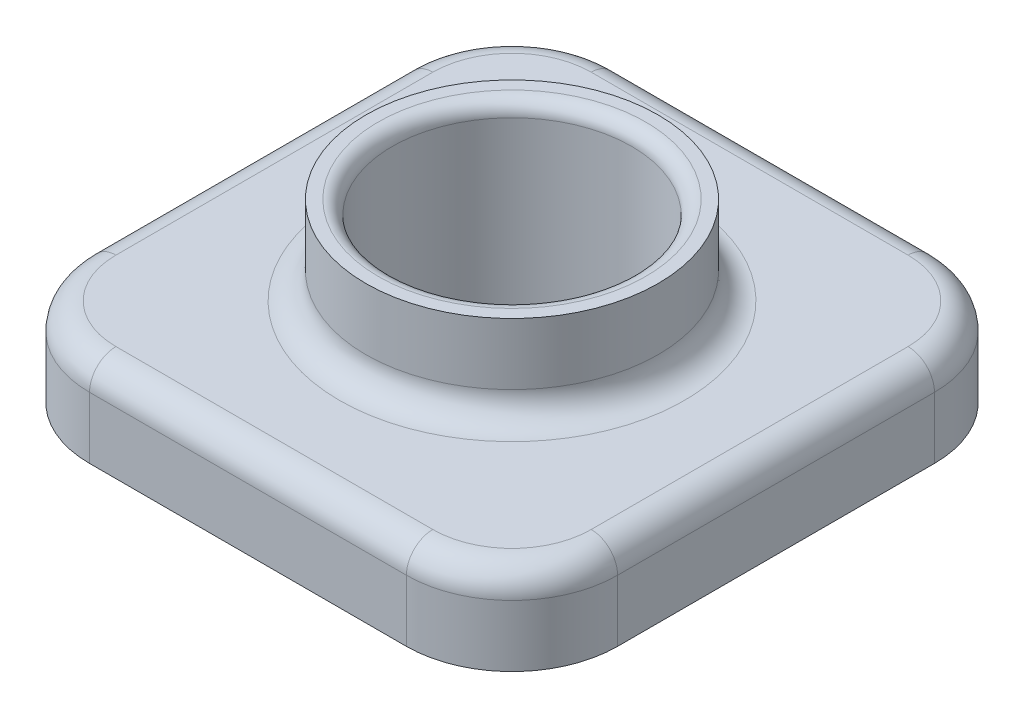
ISO-10303-21;
HEADER;
FILE_DESCRIPTION(('STEP AP214'),'2;1');
FILE_NAME('part.step','',(''),(''),'','','');
FILE_SCHEMA(('AUTOMOTIVE_DESIGN { 1 0 10303 214 1 1 1 1 }'));
ENDSEC;
DATA;
#1=APPLICATION_CONTEXT('core data for automotive mechanical design processes');
#2=APPLICATION_PROTOCOL_DEFINITION('international standard','automotive_design',2000,#1);
#3=PRODUCT_CONTEXT('',#1,'mechanical');
#4=PRODUCT('Part','Part','',(#3));
#5=PRODUCT_RELATED_PRODUCT_CATEGORY('part','',(#4));
#6=PRODUCT_DEFINITION_FORMATION('','',#4);
#7=PRODUCT_DEFINITION_CONTEXT('part definition',#1,'design');
#8=PRODUCT_DEFINITION('design','',#6,#7);
#9=PRODUCT_DEFINITION_SHAPE('','',#8);
#10=(LENGTH_UNIT() NAMED_UNIT(*) SI_UNIT(.MILLI.,.METRE.));
#11=(NAMED_UNIT(*) PLANE_ANGLE_UNIT() SI_UNIT($,.RADIAN.));
#12=(NAMED_UNIT(*) SI_UNIT($,.STERADIAN.) SOLID_ANGLE_UNIT());
#13=UNCERTAINTY_MEASURE_WITH_UNIT(LENGTH_MEASURE(1.E-05),#10,'distance_accuracy_value','');
#14=(GEOMETRIC_REPRESENTATION_CONTEXT(3) GLOBAL_UNCERTAINTY_ASSIGNED_CONTEXT((#13)) GLOBAL_UNIT_ASSIGNED_CONTEXT((#10,
#11,#12)) REPRESENTATION_CONTEXT('',''));
#15=CARTESIAN_POINT('',(0.,0.,0.));
#16=DIRECTION('',(0.,0.,1.));
#17=DIRECTION('',(1.,0.,0.));
#18=AXIS2_PLACEMENT_3D('',#15,#16,#17);
#19=CARTESIAN_POINT('',(0.,5.,0.));
#20=DIRECTION('',(0.,1.,0.));
#21=DIRECTION('',(0.,0.,1.));
#22=AXIS2_PLACEMENT_3D('',#19,#20,#21);
#23=PLANE('',#22);
#24=CARTESIAN_POINT('',(0.,5.,0.));
#25=DIRECTION('',(0.,1.,0.));
#26=DIRECTION('',(0.,0.,1.));
#27=AXIS2_PLACEMENT_3D('',#24,#25,#26);
#28=CIRCLE('',#27,7.6);
#29=CARTESIAN_POINT('',(0.,5.,7.6));
#30=VERTEX_POINT('',#29);
#31=EDGE_CURVE('E181',#30,#30,#28,.F.);
#32=ORIENTED_EDGE('',*,*,#31,.T.);
#33=EDGE_LOOP('',(#32));
#34=FACE_BOUND('',#33,.T.);
#35=CARTESIAN_POINT('',(0.,5.,0.));
#36=DIRECTION('',(0.,1.,0.));
#37=DIRECTION('',(0.,0.,1.));
#38=AXIS2_PLACEMENT_3D('',#35,#36,#37);
#39=CIRCLE('',#38,8.3);
#40=CARTESIAN_POINT('',(0.,5.,8.3));
#41=VERTEX_POINT('',#40);
#42=EDGE_CURVE('E167',#41,#41,#39,.T.);
#43=ORIENTED_EDGE('',*,*,#42,.T.);
#44=EDGE_LOOP('',(#43));
#45=FACE_BOUND('',#44,.T.);
#46=ADVANCED_FACE('F45',(#34,#45),#23,.T.);
#47=CARTESIAN_POINT('',(0.,5.,0.));
#48=DIRECTION('',(0.,-1.,0.));
#49=DIRECTION('',(0.,0.,-1.));
#50=AXIS2_PLACEMENT_3D('',#47,#48,#49);
#51=CYLINDRICAL_SURFACE('',#50,8.3);
#52=CARTESIAN_POINT('',(0.,1.5,0.));
#53=DIRECTION('',(0.,1.,0.));
#54=DIRECTION('',(0.,0.,1.));
#55=AXIS2_PLACEMENT_3D('',#52,#53,#54);
#56=CIRCLE('',#55,8.3);
#57=CARTESIAN_POINT('',(0.,1.5,8.3));
#58=VERTEX_POINT('',#57);
#59=EDGE_CURVE('E11',#58,#58,#56,.T.);
#60=ORIENTED_EDGE('',*,*,#59,.T.);
#61=EDGE_LOOP('',(#60));
#62=FACE_BOUND('',#61,.T.);
#63=ORIENTED_EDGE('',*,*,#42,.F.);
#64=EDGE_LOOP('',(#63));
#65=FACE_BOUND('',#64,.T.);
#66=ADVANCED_FACE('F365',(#62,#65),#51,.T.);
#67=CARTESIAN_POINT('',(0.,5.,0.));
#68=DIRECTION('',(0.,-1.,0.));
#69=DIRECTION('',(0.,0.,-1.));
#70=AXIS2_PLACEMENT_3D('',#67,#68,#69);
#71=CYLINDRICAL_SURFACE('',#70,6.8);
#72=CARTESIAN_POINT('',(0.,4.2,0.));
#73=DIRECTION('',(0.,1.,0.));
#74=DIRECTION('',(0.,0.,1.));
#75=AXIS2_PLACEMENT_3D('',#72,#73,#74);
#76=CIRCLE('',#75,6.8);
#77=CARTESIAN_POINT('',(0.,4.2,6.8));
#78=VERTEX_POINT('',#77);
#79=EDGE_CURVE('E172',#78,#78,#76,.T.);
#80=ORIENTED_EDGE('',*,*,#79,.T.);
#81=EDGE_LOOP('',(#80));
#82=FACE_BOUND('',#81,.T.);
#83=CARTESIAN_POINT('',(0.,-5.,0.));
#84=DIRECTION('',(0.,-1.,0.));
#85=DIRECTION('',(0.,0.,-1.));
#86=AXIS2_PLACEMENT_3D('',#83,#84,#85);
#87=CIRCLE('',#86,6.8);
#88=CARTESIAN_POINT('',(0.,-5.,-6.8));
#89=VERTEX_POINT('',#88);
#90=EDGE_CURVE('E162',#89,#89,#87,.T.);
#91=ORIENTED_EDGE('',*,*,#90,.T.);
#92=EDGE_LOOP('',(#91));
#93=FACE_BOUND('',#92,.T.);
#94=ADVANCED_FACE('F373',(#82,#93),#71,.F.);
#95=CARTESIAN_POINT('',(-9.,-5.,-9.));
#96=DIRECTION('',(0.,1.,0.));
#97=DIRECTION('',(0.,0.,1.));
#98=AXIS2_PLACEMENT_3D('',#95,#96,#97);
#99=PLANE('',#98);
#100=CARTESIAN_POINT('',(-9.,-5.,-9.));
#101=DIRECTION('',(0.,-1.,0.));
#102=DIRECTION('',(0.,0.,1.));
#103=AXIS2_PLACEMENT_3D('',#100,#101,#102);
#104=CIRCLE('',#103,6.);
#105=CARTESIAN_POINT('',(-15.,-5.,-8.99999999999996));
#106=VERTEX_POINT('',#105);
#107=CARTESIAN_POINT('',(-8.99999999999995,-5.,-15.));
#108=VERTEX_POINT('',#107);
#109=EDGE_CURVE('E153',#106,#108,#104,.T.);
#110=ORIENTED_EDGE('',*,*,#109,.T.);
#111=DIRECTION('',(1.,0.,0.));
#112=VECTOR('',#111,1.);
#113=CARTESIAN_POINT('',(-8.99999999999995,-5.,-15.));
#114=LINE('',#113,#112);
#115=CARTESIAN_POINT('',(8.99999999999996,-5.,-15.));
#116=VERTEX_POINT('',#115);
#117=EDGE_CURVE('E140',#108,#116,#114,.T.);
#118=ORIENTED_EDGE('',*,*,#117,.T.);
#119=CARTESIAN_POINT('',(9.00000000000001,-5.,-9.));
#120=DIRECTION('',(0.,-1.,0.));
#121=DIRECTION('',(0.,0.,-1.));
#122=AXIS2_PLACEMENT_3D('',#119,#120,#121);
#123=CIRCLE('',#122,6.);
#124=CARTESIAN_POINT('',(15.,-5.,-8.99999999999996));
#125=VERTEX_POINT('',#124);
#126=EDGE_CURVE('E152',#116,#125,#123,.T.);
#127=ORIENTED_EDGE('',*,*,#126,.T.);
#128=DIRECTION('',(0.,0.,1.));
#129=VECTOR('',#128,1.);
#130=CARTESIAN_POINT('',(15.,-5.,-8.99999999999996));
#131=LINE('',#130,#129);
#132=CARTESIAN_POINT('',(15.,-5.,8.99999999999996));
#133=VERTEX_POINT('',#132);
#134=EDGE_CURVE('E276',#125,#133,#131,.T.);
#135=ORIENTED_EDGE('',*,*,#134,.T.);
#136=CARTESIAN_POINT('',(9.,-5.,9.));
#137=DIRECTION('',(0.,-1.,0.));
#138=DIRECTION('',(0.,0.,1.));
#139=AXIS2_PLACEMENT_3D('',#136,#137,#138);
#140=CIRCLE('',#139,6.);
#141=CARTESIAN_POINT('',(8.99999999999996,-5.,15.));
#142=VERTEX_POINT('',#141);
#143=EDGE_CURVE('E279',#133,#142,#140,.T.);
#144=ORIENTED_EDGE('',*,*,#143,.T.);
#145=DIRECTION('',(-1.,0.,0.));
#146=VECTOR('',#145,1.);
#147=CARTESIAN_POINT('',(-8.99999999999995,-5.,15.));
#148=LINE('',#147,#146);
#149=CARTESIAN_POINT('',(-8.99999999999995,-5.,15.));
#150=VERTEX_POINT('',#149);
#151=EDGE_CURVE('E282',#142,#150,#148,.T.);
#152=ORIENTED_EDGE('',*,*,#151,.T.);
#153=CARTESIAN_POINT('',(-9.,-5.,9.));
#154=DIRECTION('',(0.,-1.,0.));
#155=DIRECTION('',(0.,0.,1.));
#156=AXIS2_PLACEMENT_3D('',#153,#154,#155);
#157=CIRCLE('',#156,6.);
#158=CARTESIAN_POINT('',(-15.,-5.,8.99999999999995));
#159=VERTEX_POINT('',#158);
#160=EDGE_CURVE('E285',#150,#159,#157,.T.);
#161=ORIENTED_EDGE('',*,*,#160,.T.);
#162=DIRECTION('',(0.,0.,-1.));
#163=VECTOR('',#162,1.);
#164=CARTESIAN_POINT('',(-15.,-5.,-8.99999999999996));
#165=LINE('',#164,#163);
#166=EDGE_CURVE('E159',#159,#106,#165,.T.);
#167=ORIENTED_EDGE('',*,*,#166,.T.);
#168=EDGE_LOOP('',(#110,#118,#127,#135,#144,#152,#161,#167));
#169=FACE_BOUND('',#168,.T.);
#170=ORIENTED_EDGE('',*,*,#90,.F.);
#171=EDGE_LOOP('',(#170));
#172=FACE_BOUND('',#171,.T.);
#173=ADVANCED_FACE('F156',(#169,#172),#99,.F.);
#174=CARTESIAN_POINT('',(-9.,0.,-9.));
#175=DIRECTION('',(0.,1.,0.));
#176=DIRECTION('',(0.,0.,1.));
#177=AXIS2_PLACEMENT_3D('',#174,#175,#176);
#178=PLANE('',#177);
#179=CARTESIAN_POINT('',(9.00000000000001,0.,-9.));
#180=DIRECTION('',(0.,1.,0.));
#181=DIRECTION('',(0.,0.,1.));
#182=AXIS2_PLACEMENT_3D('',#179,#180,#181);
#183=CIRCLE('',#182,4.5);
#184=CARTESIAN_POINT('',(13.5,0.,-8.99999999999997));
#185=VERTEX_POINT('',#184);
#186=CARTESIAN_POINT('',(8.99999999999996,0.,-13.5));
#187=VERTEX_POINT('',#186);
#188=EDGE_CURVE('E210',#185,#187,#183,.T.);
#189=ORIENTED_EDGE('',*,*,#188,.T.);
#190=DIRECTION('',(1.,0.,0.));
#191=VECTOR('',#190,1.);
#192=CARTESIAN_POINT('',(-8.99999999999995,0.,-13.5));
#193=LINE('',#192,#191);
#194=CARTESIAN_POINT('',(-8.99999999999995,0.,-13.5));
#195=VERTEX_POINT('',#194);
#196=EDGE_CURVE('E213',#187,#195,#193,.F.);
#197=ORIENTED_EDGE('',*,*,#196,.T.);
#198=CARTESIAN_POINT('',(-9.,0.,-9.));
#199=DIRECTION('',(0.,1.,0.));
#200=DIRECTION('',(0.,0.,1.));
#201=AXIS2_PLACEMENT_3D('',#198,#199,#200);
#202=CIRCLE('',#201,4.5);
#203=CARTESIAN_POINT('',(-13.5,0.,-8.99999999999996));
#204=VERTEX_POINT('',#203);
#205=EDGE_CURVE('E192',#195,#204,#202,.T.);
#206=ORIENTED_EDGE('',*,*,#205,.T.);
#207=DIRECTION('',(0.,0.,-1.));
#208=VECTOR('',#207,1.);
#209=CARTESIAN_POINT('',(-13.5,0.,8.99999999999995));
#210=LINE('',#209,#208);
#211=CARTESIAN_POINT('',(-13.5,0.,8.99999999999996));
#212=VERTEX_POINT('',#211);
#213=EDGE_CURVE('E195',#204,#212,#210,.F.);
#214=ORIENTED_EDGE('',*,*,#213,.T.);
#215=CARTESIAN_POINT('',(-9.,0.,9.));
#216=DIRECTION('',(0.,1.,0.));
#217=DIRECTION('',(0.,0.,1.));
#218=AXIS2_PLACEMENT_3D('',#215,#216,#217);
#219=CIRCLE('',#218,4.5);
#220=CARTESIAN_POINT('',(-8.99999999999995,0.,13.5));
#221=VERTEX_POINT('',#220);
#222=EDGE_CURVE('E198',#212,#221,#219,.T.);
#223=ORIENTED_EDGE('',*,*,#222,.T.);
#224=DIRECTION('',(-1.,0.,0.));
#225=VECTOR('',#224,1.);
#226=CARTESIAN_POINT('',(8.99999999999996,0.,13.5));
#227=LINE('',#226,#225);
#228=CARTESIAN_POINT('',(8.99999999999997,0.,13.5));
#229=VERTEX_POINT('',#228);
#230=EDGE_CURVE('E201',#221,#229,#227,.F.);
#231=ORIENTED_EDGE('',*,*,#230,.T.);
#232=CARTESIAN_POINT('',(9.,0.,9.));
#233=DIRECTION('',(0.,1.,0.));
#234=DIRECTION('',(0.,0.,1.));
#235=AXIS2_PLACEMENT_3D('',#232,#233,#234);
#236=CIRCLE('',#235,4.5);
#237=CARTESIAN_POINT('',(13.5,0.,8.99999999999996));
#238=VERTEX_POINT('',#237);
#239=EDGE_CURVE('E204',#229,#238,#236,.T.);
#240=ORIENTED_EDGE('',*,*,#239,.T.);
#241=DIRECTION('',(0.,0.,1.));
#242=VECTOR('',#241,1.);
#243=CARTESIAN_POINT('',(13.5,0.,-8.99999999999996));
#244=LINE('',#243,#242);
#245=EDGE_CURVE('E207',#238,#185,#244,.F.);
#246=ORIENTED_EDGE('',*,*,#245,.T.);
#247=EDGE_LOOP('',(#189,#197,#206,#214,#223,#231,#240,#246));
#248=FACE_BOUND('',#247,.T.);
#249=CARTESIAN_POINT('',(0.,0.,0.));
#250=DIRECTION('',(0.,1.,0.));
#251=DIRECTION('',(0.,0.,1.));
#252=AXIS2_PLACEMENT_3D('',#249,#250,#251);
#253=CIRCLE('',#252,9.8);
#254=CARTESIAN_POINT('',(0.,0.,9.8));
#255=VERTEX_POINT('',#254);
#256=EDGE_CURVE('E188',#255,#255,#253,.F.);
#257=ORIENTED_EDGE('',*,*,#256,.T.);
#258=EDGE_LOOP('',(#257));
#259=FACE_BOUND('',#258,.T.);
#260=ADVANCED_FACE('F327',(#248,#259),#178,.T.);
#261=CARTESIAN_POINT('',(-9.,-5.,-9.));
#262=DIRECTION('',(0.,1.,0.));
#263=DIRECTION('',(0.,0.,1.));
#264=AXIS2_PLACEMENT_3D('',#261,#262,#263);
#265=CYLINDRICAL_SURFACE('',#264,6.);
#266=DIRECTION('',(0.,1.,0.));
#267=VECTOR('',#266,1.);
#268=CARTESIAN_POINT('',(-15.,-5.,-8.99999999999996));
#269=LINE('',#268,#267);
#270=CARTESIAN_POINT('',(-15.,-1.5,-8.99999999999996));
#271=VERTEX_POINT('',#270);
#272=EDGE_CURVE('E290',#106,#271,#269,.T.);
#273=ORIENTED_EDGE('',*,*,#272,.T.);
#274=CARTESIAN_POINT('',(-9.,-1.5,-9.));
#275=DIRECTION('',(0.,1.,0.));
#276=DIRECTION('',(0.,0.,1.));
#277=AXIS2_PLACEMENT_3D('',#274,#275,#276);
#278=CIRCLE('',#277,6.);
#279=CARTESIAN_POINT('',(-8.99999999999995,-1.5,-15.));
#280=VERTEX_POINT('',#279);
#281=EDGE_CURVE('E55',#271,#280,#278,.F.);
#282=ORIENTED_EDGE('',*,*,#281,.T.);
#283=DIRECTION('',(0.,1.,0.));
#284=VECTOR('',#283,1.);
#285=CARTESIAN_POINT('',(-8.99999999999995,-5.,-15.));
#286=LINE('',#285,#284);
#287=EDGE_CURVE('E145',#108,#280,#286,.T.);
#288=ORIENTED_EDGE('',*,*,#287,.F.);
#289=ORIENTED_EDGE('',*,*,#109,.F.);
#290=EDGE_LOOP('',(#273,#282,#288,#289));
#291=FACE_BOUND('',#290,.T.);
#292=ADVANCED_FACE('F164',(#291),#265,.T.);
#293=CARTESIAN_POINT('',(-8.99999999999995,-5.,-15.));
#294=DIRECTION('',(0.,0.,1.));
#295=DIRECTION('',(1.,0.,0.));
#296=AXIS2_PLACEMENT_3D('',#293,#294,#295);
#297=PLANE('',#296);
#298=ORIENTED_EDGE('',*,*,#287,.T.);
#299=DIRECTION('',(1.,0.,0.));
#300=VECTOR('',#299,1.);
#301=CARTESIAN_POINT('',(8.99999999999996,-1.5,-15.));
#302=LINE('',#301,#300);
#303=CARTESIAN_POINT('',(8.99999999999996,-1.5,-15.));
#304=VERTEX_POINT('',#303);
#305=EDGE_CURVE('E185',#280,#304,#302,.T.);
#306=ORIENTED_EDGE('',*,*,#305,.T.);
#307=DIRECTION('',(0.,1.,0.));
#308=VECTOR('',#307,1.);
#309=CARTESIAN_POINT('',(8.99999999999996,-5.,-15.));
#310=LINE('',#309,#308);
#311=EDGE_CURVE('E148',#116,#304,#310,.T.);
#312=ORIENTED_EDGE('',*,*,#311,.F.);
#313=ORIENTED_EDGE('',*,*,#117,.F.);
#314=EDGE_LOOP('',(#298,#306,#312,#313));
#315=FACE_BOUND('',#314,.T.);
#316=ADVANCED_FACE('F142',(#315),#297,.F.);
#317=CARTESIAN_POINT('',(9.00000000000001,-5.,-9.));
#318=DIRECTION('',(0.,1.,0.));
#319=DIRECTION('',(0.,0.,1.));
#320=AXIS2_PLACEMENT_3D('',#317,#318,#319);
#321=CYLINDRICAL_SURFACE('',#320,6.);
#322=ORIENTED_EDGE('',*,*,#311,.T.);
#323=CARTESIAN_POINT('',(9.00000000000001,-1.5,-9.));
#324=DIRECTION('',(0.,1.,0.));
#325=DIRECTION('',(0.,0.,1.));
#326=AXIS2_PLACEMENT_3D('',#323,#324,#325);
#327=CIRCLE('',#326,6.);
#328=CARTESIAN_POINT('',(15.,-1.5,-8.99999999999996));
#329=VERTEX_POINT('',#328);
#330=EDGE_CURVE('E217',#304,#329,#327,.F.);
#331=ORIENTED_EDGE('',*,*,#330,.T.);
#332=DIRECTION('',(0.,1.,0.));
#333=VECTOR('',#332,1.);
#334=CARTESIAN_POINT('',(15.,-5.,-8.99999999999996));
#335=LINE('',#334,#333);
#336=EDGE_CURVE('E174',#125,#329,#335,.T.);
#337=ORIENTED_EDGE('',*,*,#336,.F.);
#338=ORIENTED_EDGE('',*,*,#126,.F.);
#339=EDGE_LOOP('',(#322,#331,#337,#338));
#340=FACE_BOUND('',#339,.T.);
#341=ADVANCED_FACE('F355',(#340),#321,.T.);
#342=CARTESIAN_POINT('',(15.,-5.,-8.99999999999996));
#343=DIRECTION('',(-1.,0.,0.));
#344=DIRECTION('',(0.,0.,1.));
#345=AXIS2_PLACEMENT_3D('',#342,#343,#344);
#346=PLANE('',#345);
#347=ORIENTED_EDGE('',*,*,#336,.T.);
#348=DIRECTION('',(0.,0.,1.));
#349=VECTOR('',#348,1.);
#350=CARTESIAN_POINT('',(15.,-1.5,8.99999999999996));
#351=LINE('',#350,#349);
#352=CARTESIAN_POINT('',(15.,-1.5,8.99999999999996));
#353=VERTEX_POINT('',#352);
#354=EDGE_CURVE('E220',#329,#353,#351,.T.);
#355=ORIENTED_EDGE('',*,*,#354,.T.);
#356=DIRECTION('',(0.,1.,0.));
#357=VECTOR('',#356,1.);
#358=CARTESIAN_POINT('',(15.,-5.,8.99999999999996));
#359=LINE('',#358,#357);
#360=EDGE_CURVE('E303',#133,#353,#359,.T.);
#361=ORIENTED_EDGE('',*,*,#360,.F.);
#362=ORIENTED_EDGE('',*,*,#134,.F.);
#363=EDGE_LOOP('',(#347,#355,#361,#362));
#364=FACE_BOUND('',#363,.T.);
#365=ADVANCED_FACE('F312',(#364),#346,.F.);
#366=CARTESIAN_POINT('',(9.,-5.,9.));
#367=DIRECTION('',(0.,1.,0.));
#368=DIRECTION('',(0.,0.,1.));
#369=AXIS2_PLACEMENT_3D('',#366,#367,#368);
#370=CYLINDRICAL_SURFACE('',#369,6.);
#371=ORIENTED_EDGE('',*,*,#360,.T.);
#372=CARTESIAN_POINT('',(9.,-1.5,9.));
#373=DIRECTION('',(0.,1.,0.));
#374=DIRECTION('',(0.,0.,1.));
#375=AXIS2_PLACEMENT_3D('',#372,#373,#374);
#376=CIRCLE('',#375,6.);
#377=CARTESIAN_POINT('',(8.99999999999996,-1.5,15.));
#378=VERTEX_POINT('',#377);
#379=EDGE_CURVE('E223',#353,#378,#376,.F.);
#380=ORIENTED_EDGE('',*,*,#379,.T.);
#381=DIRECTION('',(0.,1.,0.));
#382=VECTOR('',#381,1.);
#383=CARTESIAN_POINT('',(8.99999999999996,-5.,15.));
#384=LINE('',#383,#382);
#385=EDGE_CURVE('E299',#142,#378,#384,.T.);
#386=ORIENTED_EDGE('',*,*,#385,.F.);
#387=ORIENTED_EDGE('',*,*,#143,.F.);
#388=EDGE_LOOP('',(#371,#380,#386,#387));
#389=FACE_BOUND('',#388,.T.);
#390=ADVANCED_FACE('F348',(#389),#370,.T.);
#391=CARTESIAN_POINT('',(-8.99999999999995,-5.,15.));
#392=DIRECTION('',(0.,0.,-1.));
#393=DIRECTION('',(-1.,0.,0.));
#394=AXIS2_PLACEMENT_3D('',#391,#392,#393);
#395=PLANE('',#394);
#396=ORIENTED_EDGE('',*,*,#385,.T.);
#397=DIRECTION('',(-1.,0.,0.));
#398=VECTOR('',#397,1.);
#399=CARTESIAN_POINT('',(-8.99999999999995,-1.5,15.));
#400=LINE('',#399,#398);
#401=CARTESIAN_POINT('',(-8.99999999999995,-1.5,15.));
#402=VERTEX_POINT('',#401);
#403=EDGE_CURVE('E226',#378,#402,#400,.T.);
#404=ORIENTED_EDGE('',*,*,#403,.T.);
#405=DIRECTION('',(0.,1.,0.));
#406=VECTOR('',#405,1.);
#407=CARTESIAN_POINT('',(-8.99999999999995,-5.,15.));
#408=LINE('',#407,#406);
#409=EDGE_CURVE('E296',#150,#402,#408,.T.);
#410=ORIENTED_EDGE('',*,*,#409,.F.);
#411=ORIENTED_EDGE('',*,*,#151,.F.);
#412=EDGE_LOOP('',(#396,#404,#410,#411));
#413=FACE_BOUND('',#412,.T.);
#414=ADVANCED_FACE('F352',(#413),#395,.F.);
#415=CARTESIAN_POINT('',(-9.,-5.,9.));
#416=DIRECTION('',(0.,1.,0.));
#417=DIRECTION('',(0.,0.,1.));
#418=AXIS2_PLACEMENT_3D('',#415,#416,#417);
#419=CYLINDRICAL_SURFACE('',#418,6.);
#420=ORIENTED_EDGE('',*,*,#409,.T.);
#421=CARTESIAN_POINT('',(-9.,-1.5,9.));
#422=DIRECTION('',(0.,1.,0.));
#423=DIRECTION('',(0.,0.,1.));
#424=AXIS2_PLACEMENT_3D('',#421,#422,#423);
#425=CIRCLE('',#424,6.);
#426=CARTESIAN_POINT('',(-15.,-1.5,8.99999999999995));
#427=VERTEX_POINT('',#426);
#428=EDGE_CURVE('E71',#402,#427,#425,.F.);
#429=ORIENTED_EDGE('',*,*,#428,.T.);
#430=DIRECTION('',(0.,1.,0.));
#431=VECTOR('',#430,1.);
#432=CARTESIAN_POINT('',(-15.,-5.,8.99999999999995));
#433=LINE('',#432,#431);
#434=EDGE_CURVE('E293',#159,#427,#433,.T.);
#435=ORIENTED_EDGE('',*,*,#434,.F.);
#436=ORIENTED_EDGE('',*,*,#160,.F.);
#437=EDGE_LOOP('',(#420,#429,#435,#436));
#438=FACE_BOUND('',#437,.T.);
#439=ADVANCED_FACE('F467',(#438),#419,.T.);
#440=CARTESIAN_POINT('',(-15.,-5.,-8.99999999999996));
#441=DIRECTION('',(1.,0.,0.));
#442=DIRECTION('',(0.,0.,-1.));
#443=AXIS2_PLACEMENT_3D('',#440,#441,#442);
#444=PLANE('',#443);
#445=ORIENTED_EDGE('',*,*,#434,.T.);
#446=DIRECTION('',(0.,0.,-1.));
#447=VECTOR('',#446,1.);
#448=CARTESIAN_POINT('',(-15.,-1.5,-8.99999999999996));
#449=LINE('',#448,#447);
#450=EDGE_CURVE('E63',#427,#271,#449,.T.);
#451=ORIENTED_EDGE('',*,*,#450,.T.);
#452=ORIENTED_EDGE('',*,*,#272,.F.);
#453=ORIENTED_EDGE('',*,*,#166,.F.);
#454=EDGE_LOOP('',(#445,#451,#452,#453));
#455=FACE_BOUND('',#454,.T.);
#456=ADVANCED_FACE('F383',(#455),#444,.F.);
#457=CARTESIAN_POINT('',(0.,4.2,0.));
#458=DIRECTION('',(0.,1.,0.));
#459=DIRECTION('',(0.,0.,1.));
#460=AXIS2_PLACEMENT_3D('',#457,#458,#459);
#461=TOROIDAL_SURFACE('',#460,7.6,0.8);
#462=ORIENTED_EDGE('',*,*,#31,.F.);
#463=EDGE_LOOP('',(#462));
#464=FACE_BOUND('',#463,.T.);
#465=ORIENTED_EDGE('',*,*,#79,.F.);
#466=EDGE_LOOP('',(#465));
#467=FACE_BOUND('',#466,.T.);
#468=ADVANCED_FACE('F380',(#464,#467),#461,.T.);
#469=CARTESIAN_POINT('',(-8.99999999999995,-1.5,13.5));
#470=DIRECTION('',(1.,0.,0.));
#471=DIRECTION('',(0.,0.,-1.));
#472=AXIS2_PLACEMENT_3D('',#469,#470,#471);
#473=CYLINDRICAL_SURFACE('',#472,1.5);
#474=CARTESIAN_POINT('',(8.99999999999997,-1.5,13.5));
#475=DIRECTION('',(1.,0.,0.));
#476=DIRECTION('',(0.,0.,-1.));
#477=AXIS2_PLACEMENT_3D('',#474,#475,#476);
#478=CIRCLE('',#477,1.5);
#479=EDGE_CURVE('E256',#229,#378,#478,.T.);
#480=ORIENTED_EDGE('',*,*,#479,.F.);
#481=ORIENTED_EDGE('',*,*,#230,.F.);
#482=CARTESIAN_POINT('',(-8.99999999999995,-1.5,13.5));
#483=DIRECTION('',(-1.,0.,0.));
#484=DIRECTION('',(0.,0.,1.));
#485=AXIS2_PLACEMENT_3D('',#482,#483,#484);
#486=CIRCLE('',#485,1.5);
#487=EDGE_CURVE('E49',#402,#221,#486,.T.);
#488=ORIENTED_EDGE('',*,*,#487,.F.);
#489=ORIENTED_EDGE('',*,*,#403,.F.);
#490=EDGE_LOOP('',(#480,#481,#488,#489));
#491=FACE_BOUND('',#490,.T.);
#492=ADVANCED_FACE('F343',(#491),#473,.T.);
#493=CARTESIAN_POINT('',(-9.,-1.5,9.));
#494=DIRECTION('',(0.,1.,0.));
#495=DIRECTION('',(0.,0.,1.));
#496=AXIS2_PLACEMENT_3D('',#493,#494,#495);
#497=TOROIDAL_SURFACE('',#496,4.5,1.5);
#498=ORIENTED_EDGE('',*,*,#487,.T.);
#499=ORIENTED_EDGE('',*,*,#222,.F.);
#500=CARTESIAN_POINT('',(-13.5,-1.5,8.99999999999996));
#501=DIRECTION('',(0.,0.,-1.));
#502=DIRECTION('',(-1.,0.,0.));
#503=AXIS2_PLACEMENT_3D('',#500,#501,#502);
#504=CIRCLE('',#503,1.5);
#505=EDGE_CURVE('E253',#427,#212,#504,.T.);
#506=ORIENTED_EDGE('',*,*,#505,.F.);
#507=ORIENTED_EDGE('',*,*,#428,.F.);
#508=EDGE_LOOP('',(#498,#499,#506,#507));
#509=FACE_BOUND('',#508,.T.);
#510=ADVANCED_FACE('F340',(#509),#497,.T.);
#511=CARTESIAN_POINT('',(9.,-1.5,9.));
#512=DIRECTION('',(0.,1.,0.));
#513=DIRECTION('',(0.,0.,1.));
#514=AXIS2_PLACEMENT_3D('',#511,#512,#513);
#515=TOROIDAL_SURFACE('',#514,4.5,1.5);
#516=ORIENTED_EDGE('',*,*,#479,.T.);
#517=ORIENTED_EDGE('',*,*,#379,.F.);
#518=CARTESIAN_POINT('',(13.5,-1.5,8.99999999999996));
#519=DIRECTION('',(0.,0.,-1.));
#520=DIRECTION('',(-1.,0.,0.));
#521=AXIS2_PLACEMENT_3D('',#518,#519,#520);
#522=CIRCLE('',#521,1.5);
#523=EDGE_CURVE('E249',#238,#353,#522,.T.);
#524=ORIENTED_EDGE('',*,*,#523,.F.);
#525=ORIENTED_EDGE('',*,*,#239,.F.);
#526=EDGE_LOOP('',(#516,#517,#524,#525));
#527=FACE_BOUND('',#526,.T.);
#528=ADVANCED_FACE('F345',(#527),#515,.T.);
#529=CARTESIAN_POINT('',(-13.5,-1.5,-8.99999999999996));
#530=DIRECTION('',(0.,0.,1.));
#531=DIRECTION('',(1.,0.,0.));
#532=AXIS2_PLACEMENT_3D('',#529,#530,#531);
#533=CYLINDRICAL_SURFACE('',#532,1.5);
#534=ORIENTED_EDGE('',*,*,#505,.T.);
#535=ORIENTED_EDGE('',*,*,#213,.F.);
#536=CARTESIAN_POINT('',(-13.5,-1.5,-8.99999999999996));
#537=DIRECTION('',(0.,0.,-1.));
#538=DIRECTION('',(-1.,0.,0.));
#539=AXIS2_PLACEMENT_3D('',#536,#537,#538);
#540=CIRCLE('',#539,1.5);
#541=EDGE_CURVE('E245',#271,#204,#540,.T.);
#542=ORIENTED_EDGE('',*,*,#541,.F.);
#543=ORIENTED_EDGE('',*,*,#450,.F.);
#544=EDGE_LOOP('',(#534,#535,#542,#543));
#545=FACE_BOUND('',#544,.T.);
#546=ADVANCED_FACE('F338',(#545),#533,.T.);
#547=CARTESIAN_POINT('',(13.5,-1.5,-8.99999999999996));
#548=DIRECTION('',(0.,0.,-1.));
#549=DIRECTION('',(-1.,0.,0.));
#550=AXIS2_PLACEMENT_3D('',#547,#548,#549);
#551=CYLINDRICAL_SURFACE('',#550,1.5);
#552=ORIENTED_EDGE('',*,*,#523,.T.);
#553=ORIENTED_EDGE('',*,*,#354,.F.);
#554=CARTESIAN_POINT('',(13.5,-1.5,-8.99999999999997));
#555=DIRECTION('',(0.,0.,-1.));
#556=DIRECTION('',(-1.,0.,0.));
#557=AXIS2_PLACEMENT_3D('',#554,#555,#556);
#558=CIRCLE('',#557,1.5);
#559=EDGE_CURVE('E241',#185,#329,#558,.T.);
#560=ORIENTED_EDGE('',*,*,#559,.F.);
#561=ORIENTED_EDGE('',*,*,#245,.F.);
#562=EDGE_LOOP('',(#552,#553,#560,#561));
#563=FACE_BOUND('',#562,.T.);
#564=ADVANCED_FACE('F317',(#563),#551,.T.);
#565=CARTESIAN_POINT('',(-9.,-1.5,-9.));
#566=DIRECTION('',(0.,1.,0.));
#567=DIRECTION('',(0.,0.,1.));
#568=AXIS2_PLACEMENT_3D('',#565,#566,#567);
#569=TOROIDAL_SURFACE('',#568,4.5,1.5);
#570=ORIENTED_EDGE('',*,*,#541,.T.);
#571=ORIENTED_EDGE('',*,*,#205,.F.);
#572=CARTESIAN_POINT('',(-8.99999999999996,-1.5,-13.5));
#573=DIRECTION('',(1.,0.,0.));
#574=DIRECTION('',(0.,1.,0.));
#575=AXIS2_PLACEMENT_3D('',#572,#573,#574);
#576=CIRCLE('',#575,1.5);
#577=EDGE_CURVE('E238',#280,#195,#576,.T.);
#578=ORIENTED_EDGE('',*,*,#577,.F.);
#579=ORIENTED_EDGE('',*,*,#281,.F.);
#580=EDGE_LOOP('',(#570,#571,#578,#579));
#581=FACE_BOUND('',#580,.T.);
#582=ADVANCED_FACE('F334',(#581),#569,.T.);
#583=CARTESIAN_POINT('',(9.00000000000001,-1.5,-9.));
#584=DIRECTION('',(0.,1.,0.));
#585=DIRECTION('',(0.,0.,1.));
#586=AXIS2_PLACEMENT_3D('',#583,#584,#585);
#587=TOROIDAL_SURFACE('',#586,4.5,1.5);
#588=ORIENTED_EDGE('',*,*,#559,.T.);
#589=ORIENTED_EDGE('',*,*,#330,.F.);
#590=CARTESIAN_POINT('',(8.99999999999996,-1.5,-13.5));
#591=DIRECTION('',(-1.,0.,0.));
#592=DIRECTION('',(0.,0.,1.));
#593=AXIS2_PLACEMENT_3D('',#590,#591,#592);
#594=CIRCLE('',#593,1.5);
#595=EDGE_CURVE('E235',#187,#304,#594,.T.);
#596=ORIENTED_EDGE('',*,*,#595,.F.);
#597=ORIENTED_EDGE('',*,*,#188,.F.);
#598=EDGE_LOOP('',(#588,#589,#596,#597));
#599=FACE_BOUND('',#598,.T.);
#600=ADVANCED_FACE('F323',(#599),#587,.T.);
#601=CARTESIAN_POINT('',(-8.99999999999995,-1.5,-13.5));
#602=DIRECTION('',(-1.,0.,0.));
#603=DIRECTION('',(0.,0.,1.));
#604=AXIS2_PLACEMENT_3D('',#601,#602,#603);
#605=CYLINDRICAL_SURFACE('',#604,1.5);
#606=ORIENTED_EDGE('',*,*,#577,.T.);
#607=ORIENTED_EDGE('',*,*,#196,.F.);
#608=ORIENTED_EDGE('',*,*,#595,.T.);
#609=ORIENTED_EDGE('',*,*,#305,.F.);
#610=EDGE_LOOP('',(#606,#607,#608,#609));
#611=FACE_BOUND('',#610,.T.);
#612=ADVANCED_FACE('F330',(#611),#605,.T.);
#613=CARTESIAN_POINT('',(0.,1.5,0.));
#614=DIRECTION('',(0.,1.,0.));
#615=DIRECTION('',(0.,0.,1.));
#616=AXIS2_PLACEMENT_3D('',#613,#614,#615);
#617=TOROIDAL_SURFACE('',#616,9.8,1.5);
#618=ORIENTED_EDGE('',*,*,#256,.F.);
#619=EDGE_LOOP('',(#618));
#620=FACE_BOUND('',#619,.T.);
#621=ORIENTED_EDGE('',*,*,#59,.F.);
#622=EDGE_LOOP('',(#621));
#623=FACE_BOUND('',#622,.T.);
#624=ADVANCED_FACE('F47',(#620,#623),#617,.F.);
#625=CLOSED_SHELL('',(#46,#66,#94,#173,#260,#292,#316,#341,#365,#390,#414,#439,#456,#468,#492,
#510,#528,#546,#564,#582,#600,#612,#624));
#626=MANIFOLD_SOLID_BREP('B2',#625);
#627=ADVANCED_BREP_SHAPE_REPRESENTATION('',(#18,#626),#14);
#628=SHAPE_DEFINITION_REPRESENTATION(#9,#627);
ENDSEC;
END-ISO-10303-21;
